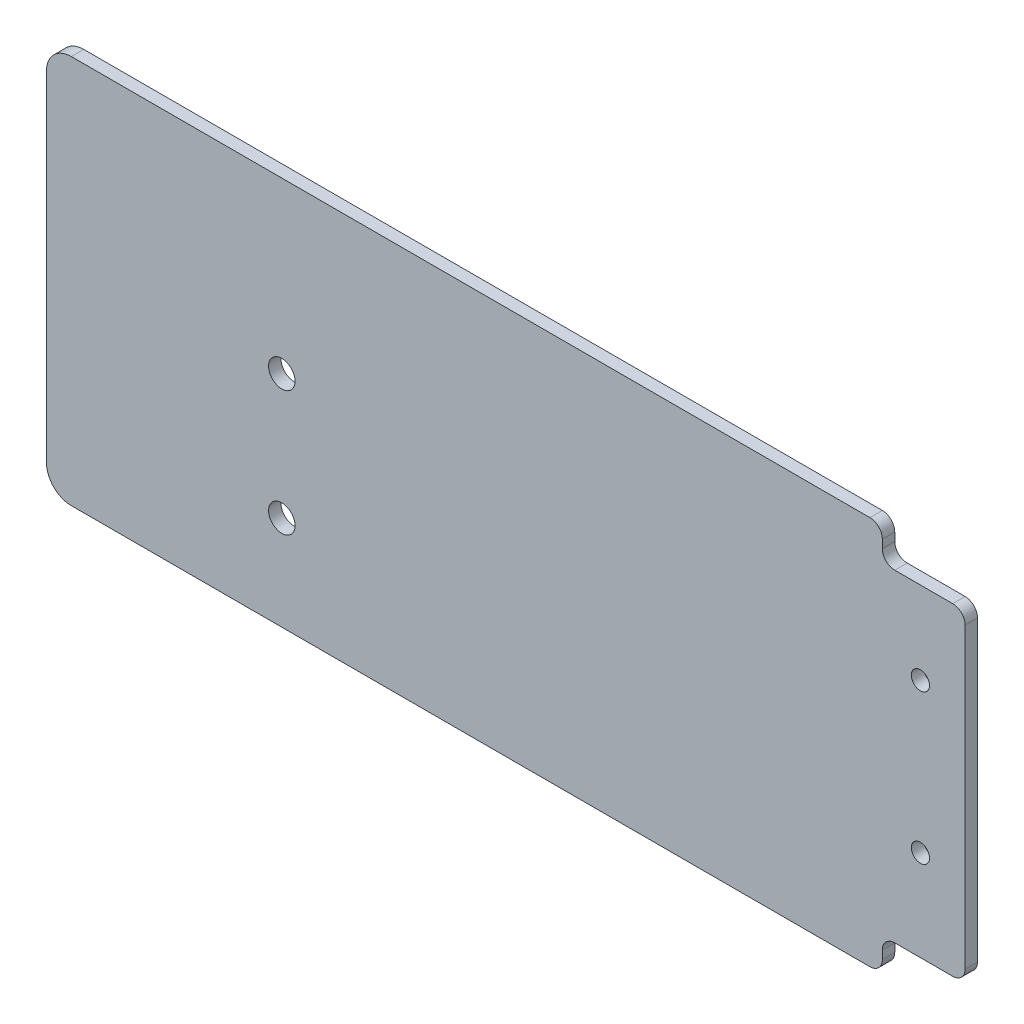
ISO-10303-21;
HEADER;
FILE_DESCRIPTION(('STEP AP214'),'2;1');
FILE_NAME('part.step','',(''),(''),'','','');
FILE_SCHEMA(('AUTOMOTIVE_DESIGN { 1 0 10303 214 1 1 1 1 }'));
ENDSEC;
DATA;
#1=APPLICATION_CONTEXT('core data for automotive mechanical design processes');
#2=APPLICATION_PROTOCOL_DEFINITION('international standard','automotive_design',2000,#1);
#3=PRODUCT_CONTEXT('',#1,'mechanical');
#4=PRODUCT('Part','Part','',(#3));
#5=PRODUCT_RELATED_PRODUCT_CATEGORY('part','',(#4));
#6=PRODUCT_DEFINITION_FORMATION('','',#4);
#7=PRODUCT_DEFINITION_CONTEXT('part definition',#1,'design');
#8=PRODUCT_DEFINITION('design','',#6,#7);
#9=PRODUCT_DEFINITION_SHAPE('','',#8);
#10=(LENGTH_UNIT() NAMED_UNIT(*) SI_UNIT(.MILLI.,.METRE.));
#11=(NAMED_UNIT(*) PLANE_ANGLE_UNIT() SI_UNIT($,.RADIAN.));
#12=(NAMED_UNIT(*) SI_UNIT($,.STERADIAN.) SOLID_ANGLE_UNIT());
#13=UNCERTAINTY_MEASURE_WITH_UNIT(LENGTH_MEASURE(1.E-05),#10,'distance_accuracy_value','');
#14=(GEOMETRIC_REPRESENTATION_CONTEXT(3) GLOBAL_UNCERTAINTY_ASSIGNED_CONTEXT((#13)) GLOBAL_UNIT_ASSIGNED_CONTEXT((#10,
#11,#12)) REPRESENTATION_CONTEXT('',''));
#15=CARTESIAN_POINT('',(0.,0.,0.));
#16=DIRECTION('',(0.,0.,1.));
#17=DIRECTION('',(1.,0.,0.));
#18=AXIS2_PLACEMENT_3D('',#15,#16,#17);
#19=CARTESIAN_POINT('',(3.,-20.5,1.5));
#20=DIRECTION('',(0.,0.,-1.));
#21=DIRECTION('',(-1.,0.,0.));
#22=AXIS2_PLACEMENT_3D('',#19,#20,#21);
#23=PLANE('',#22);
#24=CARTESIAN_POINT('',(105.6,-8.52499999999999,1.5));
#25=DIRECTION('',(0.,0.,1.));
#26=DIRECTION('',(1.,0.,0.));
#27=AXIS2_PLACEMENT_3D('',#24,#25,#26);
#28=CIRCLE('',#27,1.09999999999999);
#29=CARTESIAN_POINT('',(106.7,-8.52499999999999,1.5));
#30=VERTEX_POINT('',#29);
#31=EDGE_CURVE('E402',#30,#30,#28,.T.);
#32=ORIENTED_EDGE('',*,*,#31,.F.);
#33=EDGE_LOOP('',(#32));
#34=FACE_BOUND('',#33,.T.);
#35=DIRECTION('',(1.,0.,0.));
#36=VECTOR('',#35,1.);
#37=CARTESIAN_POINT('',(3.,-23.5,1.5));
#38=LINE('',#37,#36);
#39=CARTESIAN_POINT('',(3.,-23.5,1.5));
#40=VERTEX_POINT('',#39);
#41=CARTESIAN_POINT('',(99.5,-23.5,1.5));
#42=VERTEX_POINT('',#41);
#43=EDGE_CURVE('E182',#40,#42,#38,.T.);
#44=ORIENTED_EDGE('',*,*,#43,.T.);
#45=CARTESIAN_POINT('',(99.5,-22.,1.5));
#46=DIRECTION('',(0.,0.,-1.));
#47=DIRECTION('',(-1.,0.,0.));
#48=AXIS2_PLACEMENT_3D('',#45,#46,#47);
#49=CIRCLE('',#48,1.5);
#50=CARTESIAN_POINT('',(101.,-22.,1.5));
#51=VERTEX_POINT('',#50);
#52=EDGE_CURVE('E247',#42,#51,#49,.F.);
#53=ORIENTED_EDGE('',*,*,#52,.T.);
#54=DIRECTION('',(0.,1.,0.));
#55=VECTOR('',#54,1.);
#56=CARTESIAN_POINT('',(101.,0.,1.5));
#57=LINE('',#56,#55);
#58=CARTESIAN_POINT('',(101.,-21.,1.5));
#59=VERTEX_POINT('',#58);
#60=EDGE_CURVE('E364',#51,#59,#57,.T.);
#61=ORIENTED_EDGE('',*,*,#60,.T.);
#62=CARTESIAN_POINT('',(102.5,-21.,1.5));
#63=DIRECTION('',(0.,0.,-1.));
#64=DIRECTION('',(-1.,0.,0.));
#65=AXIS2_PLACEMENT_3D('',#62,#63,#64);
#66=CIRCLE('',#65,1.5);
#67=CARTESIAN_POINT('',(102.5,-19.5,1.5));
#68=VERTEX_POINT('',#67);
#69=EDGE_CURVE('E285',#59,#68,#66,.T.);
#70=ORIENTED_EDGE('',*,*,#69,.T.);
#71=DIRECTION('',(1.,0.,0.));
#72=VECTOR('',#71,1.);
#73=CARTESIAN_POINT('',(0.,-19.5,1.5));
#74=LINE('',#73,#72);
#75=CARTESIAN_POINT('',(109.5,-19.5,1.5));
#76=VERTEX_POINT('',#75);
#77=EDGE_CURVE('E306',#68,#76,#74,.T.);
#78=ORIENTED_EDGE('',*,*,#77,.T.);
#79=CARTESIAN_POINT('',(109.5,-18.,1.5));
#80=DIRECTION('',(0.,0.,-1.));
#81=DIRECTION('',(-1.,0.,0.));
#82=AXIS2_PLACEMENT_3D('',#79,#80,#81);
#83=CIRCLE('',#82,1.5);
#84=CARTESIAN_POINT('',(111.,-18.,1.5));
#85=VERTEX_POINT('',#84);
#86=EDGE_CURVE('E244',#76,#85,#83,.F.);
#87=ORIENTED_EDGE('',*,*,#86,.T.);
#88=DIRECTION('',(0.,1.,0.));
#89=VECTOR('',#88,1.);
#90=CARTESIAN_POINT('',(111.,-21.5,1.5));
#91=LINE('',#90,#89);
#92=CARTESIAN_POINT('',(111.,18.,1.5));
#93=VERTEX_POINT('',#92);
#94=EDGE_CURVE('E193',#85,#93,#91,.T.);
#95=ORIENTED_EDGE('',*,*,#94,.T.);
#96=CARTESIAN_POINT('',(109.5,18.,1.5));
#97=DIRECTION('',(0.,0.,-1.));
#98=DIRECTION('',(-1.,0.,0.));
#99=AXIS2_PLACEMENT_3D('',#96,#97,#98);
#100=CIRCLE('',#99,1.5);
#101=CARTESIAN_POINT('',(109.5,19.5,1.5));
#102=VERTEX_POINT('',#101);
#103=EDGE_CURVE('E241',#93,#102,#100,.F.);
#104=ORIENTED_EDGE('',*,*,#103,.T.);
#105=DIRECTION('',(1.,0.,0.));
#106=VECTOR('',#105,1.);
#107=CARTESIAN_POINT('',(0.,19.5,1.5));
#108=LINE('',#107,#106);
#109=CARTESIAN_POINT('',(102.5,19.5,1.5));
#110=VERTEX_POINT('',#109);
#111=EDGE_CURVE('E314',#110,#102,#108,.T.);
#112=ORIENTED_EDGE('',*,*,#111,.F.);
#113=CARTESIAN_POINT('',(102.5,21.,1.5));
#114=DIRECTION('',(0.,0.,-1.));
#115=DIRECTION('',(-1.,0.,0.));
#116=AXIS2_PLACEMENT_3D('',#113,#114,#115);
#117=CIRCLE('',#116,1.5);
#118=CARTESIAN_POINT('',(101.,21.,1.5));
#119=VERTEX_POINT('',#118);
#120=EDGE_CURVE('E11',#110,#119,#117,.T.);
#121=ORIENTED_EDGE('',*,*,#120,.T.);
#122=DIRECTION('',(0.,-1.,0.));
#123=VECTOR('',#122,1.);
#124=CARTESIAN_POINT('',(101.,0.,1.5));
#125=LINE('',#124,#123);
#126=CARTESIAN_POINT('',(101.,22.,1.5));
#127=VERTEX_POINT('',#126);
#128=EDGE_CURVE('E312',#127,#119,#125,.T.);
#129=ORIENTED_EDGE('',*,*,#128,.F.);
#130=CARTESIAN_POINT('',(99.5,22.,1.5));
#131=DIRECTION('',(0.,0.,-1.));
#132=DIRECTION('',(-1.,0.,0.));
#133=AXIS2_PLACEMENT_3D('',#130,#131,#132);
#134=CIRCLE('',#133,1.5);
#135=CARTESIAN_POINT('',(99.5,23.5,1.5));
#136=VERTEX_POINT('',#135);
#137=EDGE_CURVE('E59',#127,#136,#134,.F.);
#138=ORIENTED_EDGE('',*,*,#137,.T.);
#139=DIRECTION('',(-1.,0.,0.));
#140=VECTOR('',#139,1.);
#141=CARTESIAN_POINT('',(2.99999999999999,23.5,1.5));
#142=LINE('',#141,#140);
#143=CARTESIAN_POINT('',(2.99999999999999,23.5,1.5));
#144=VERTEX_POINT('',#143);
#145=EDGE_CURVE('E328',#136,#144,#142,.T.);
#146=ORIENTED_EDGE('',*,*,#145,.T.);
#147=CARTESIAN_POINT('',(2.99999999999999,20.5,1.5));
#148=DIRECTION('',(0.,0.,1.));
#149=DIRECTION('',(-1.,0.,0.));
#150=AXIS2_PLACEMENT_3D('',#147,#148,#149);
#151=CIRCLE('',#150,3.);
#152=CARTESIAN_POINT('',(0.,20.5,1.5));
#153=VERTEX_POINT('',#152);
#154=EDGE_CURVE('E331',#144,#153,#151,.T.);
#155=ORIENTED_EDGE('',*,*,#154,.T.);
#156=DIRECTION('',(0.,-1.,0.));
#157=VECTOR('',#156,1.);
#158=CARTESIAN_POINT('',(0.,-20.5,1.5));
#159=LINE('',#158,#157);
#160=CARTESIAN_POINT('',(0.,-20.5,1.5));
#161=VERTEX_POINT('',#160);
#162=EDGE_CURVE('E199',#153,#161,#159,.T.);
#163=ORIENTED_EDGE('',*,*,#162,.T.);
#164=CARTESIAN_POINT('',(3.,-20.5,1.5));
#165=DIRECTION('',(0.,0.,1.));
#166=DIRECTION('',(-1.,0.,0.));
#167=AXIS2_PLACEMENT_3D('',#164,#165,#166);
#168=CIRCLE('',#167,3.);
#169=EDGE_CURVE('E194',#161,#40,#168,.T.);
#170=ORIENTED_EDGE('',*,*,#169,.T.);
#171=EDGE_LOOP('',(#44,#53,#61,#70,#78,#87,#95,#104,#112,#121,#129,#138,#146,#155,#163,#170));
#172=FACE_BOUND('',#171,.T.);
#173=CARTESIAN_POINT('',(28.437,-12.0821,1.5));
#174=DIRECTION('',(0.,0.,1.));
#175=DIRECTION('',(1.,0.,0.));
#176=AXIS2_PLACEMENT_3D('',#173,#174,#175);
#177=CIRCLE('',#176,1.6);
#178=CARTESIAN_POINT('',(30.037,-12.0821,1.5));
#179=VERTEX_POINT('',#178);
#180=EDGE_CURVE('E386',#179,#179,#177,.T.);
#181=ORIENTED_EDGE('',*,*,#180,.F.);
#182=EDGE_LOOP('',(#181));
#183=FACE_BOUND('',#182,.T.);
#184=CARTESIAN_POINT('',(28.437,3.03090000000001,1.5));
#185=DIRECTION('',(0.,0.,1.));
#186=DIRECTION('',(1.,0.,0.));
#187=AXIS2_PLACEMENT_3D('',#184,#185,#186);
#188=CIRCLE('',#187,1.6);
#189=CARTESIAN_POINT('',(30.037,3.03090000000001,1.5));
#190=VERTEX_POINT('',#189);
#191=EDGE_CURVE('E394',#190,#190,#188,.T.);
#192=ORIENTED_EDGE('',*,*,#191,.F.);
#193=EDGE_LOOP('',(#192));
#194=FACE_BOUND('',#193,.T.);
#195=CARTESIAN_POINT('',(105.6,9.52500000000002,1.5));
#196=DIRECTION('',(0.,0.,1.));
#197=DIRECTION('',(1.,0.,0.));
#198=AXIS2_PLACEMENT_3D('',#195,#196,#197);
#199=CIRCLE('',#198,1.09999999999999);
#200=CARTESIAN_POINT('',(106.7,9.52500000000002,1.5));
#201=VERTEX_POINT('',#200);
#202=EDGE_CURVE('E409',#201,#201,#199,.T.);
#203=ORIENTED_EDGE('',*,*,#202,.F.);
#204=EDGE_LOOP('',(#203));
#205=FACE_BOUND('',#204,.T.);
#206=ADVANCED_FACE('F41',(#34,#172,#183,#194,#205),#23,.F.);
#207=CARTESIAN_POINT('',(111.,-21.5,1.5));
#208=DIRECTION('',(-1.,0.,0.));
#209=DIRECTION('',(0.,-1.,0.));
#210=AXIS2_PLACEMENT_3D('',#207,#208,#209);
#211=PLANE('',#210);
#212=ORIENTED_EDGE('',*,*,#94,.F.);
#213=DIRECTION('',(0.,0.,-1.));
#214=VECTOR('',#213,1.);
#215=CARTESIAN_POINT('',(111.,-18.,1.5));
#216=LINE('',#215,#214);
#217=CARTESIAN_POINT('',(111.,-18.,0.));
#218=VERTEX_POINT('',#217);
#219=EDGE_CURVE('E260',#85,#218,#216,.T.);
#220=ORIENTED_EDGE('',*,*,#219,.T.);
#221=DIRECTION('',(0.,1.,0.));
#222=VECTOR('',#221,1.);
#223=CARTESIAN_POINT('',(111.,-21.5,0.));
#224=LINE('',#223,#222);
#225=CARTESIAN_POINT('',(111.,18.,0.));
#226=VERTEX_POINT('',#225);
#227=EDGE_CURVE('E338',#218,#226,#224,.T.);
#228=ORIENTED_EDGE('',*,*,#227,.T.);
#229=DIRECTION('',(0.,0.,-1.));
#230=VECTOR('',#229,1.);
#231=CARTESIAN_POINT('',(111.,18.,1.5));
#232=LINE('',#231,#230);
#233=EDGE_CURVE('E257',#226,#93,#232,.F.);
#234=ORIENTED_EDGE('',*,*,#233,.T.);
#235=EDGE_LOOP('',(#212,#220,#228,#234));
#236=FACE_BOUND('',#235,.T.);
#237=ADVANCED_FACE('F417',(#236),#211,.F.);
#238=CARTESIAN_POINT('',(2.99999999999999,23.5,1.5));
#239=DIRECTION('',(0.,-1.,0.));
#240=DIRECTION('',(1.,0.,0.));
#241=AXIS2_PLACEMENT_3D('',#238,#239,#240);
#242=PLANE('',#241);
#243=ORIENTED_EDGE('',*,*,#145,.F.);
#244=DIRECTION('',(0.,0.,-1.));
#245=VECTOR('',#244,1.);
#246=CARTESIAN_POINT('',(99.5,23.5,0.));
#247=LINE('',#246,#245);
#248=CARTESIAN_POINT('',(99.5,23.5,0.));
#249=VERTEX_POINT('',#248);
#250=EDGE_CURVE('E278',#136,#249,#247,.T.);
#251=ORIENTED_EDGE('',*,*,#250,.T.);
#252=DIRECTION('',(-1.,0.,0.));
#253=VECTOR('',#252,1.);
#254=CARTESIAN_POINT('',(2.99999999999999,23.5,0.));
#255=LINE('',#254,#253);
#256=CARTESIAN_POINT('',(2.99999999999999,23.5,0.));
#257=VERTEX_POINT('',#256);
#258=EDGE_CURVE('E342',#249,#257,#255,.T.);
#259=ORIENTED_EDGE('',*,*,#258,.T.);
#260=DIRECTION('',(0.,0.,-1.));
#261=VECTOR('',#260,1.);
#262=CARTESIAN_POINT('',(2.99999999999999,23.5,1.5));
#263=LINE('',#262,#261);
#264=EDGE_CURVE('E211',#144,#257,#263,.T.);
#265=ORIENTED_EDGE('',*,*,#264,.F.);
#266=EDGE_LOOP('',(#243,#251,#259,#265));
#267=FACE_BOUND('',#266,.T.);
#268=ADVANCED_FACE('F423',(#267),#242,.F.);
#269=CARTESIAN_POINT('',(3.,-20.5,0.));
#270=DIRECTION('',(0.,0.,-1.));
#271=DIRECTION('',(-1.,0.,0.));
#272=AXIS2_PLACEMENT_3D('',#269,#270,#271);
#273=PLANE('',#272);
#274=CARTESIAN_POINT('',(105.6,9.52500000000002,0.));
#275=DIRECTION('',(0.,0.,-1.));
#276=DIRECTION('',(-1.,0.,0.));
#277=AXIS2_PLACEMENT_3D('',#274,#275,#276);
#278=CIRCLE('',#277,1.1);
#279=CARTESIAN_POINT('',(104.5,9.52500000000002,0.));
#280=VERTEX_POINT('',#279);
#281=EDGE_CURVE('E405',#280,#280,#278,.T.);
#282=ORIENTED_EDGE('',*,*,#281,.F.);
#283=EDGE_LOOP('',(#282));
#284=FACE_BOUND('',#283,.T.);
#285=CARTESIAN_POINT('',(105.6,-8.52499999999999,0.));
#286=DIRECTION('',(0.,0.,-1.));
#287=DIRECTION('',(-1.,0.,0.));
#288=AXIS2_PLACEMENT_3D('',#285,#286,#287);
#289=CIRCLE('',#288,1.1);
#290=CARTESIAN_POINT('',(104.5,-8.52499999999999,0.));
#291=VERTEX_POINT('',#290);
#292=EDGE_CURVE('E399',#291,#291,#289,.T.);
#293=ORIENTED_EDGE('',*,*,#292,.F.);
#294=EDGE_LOOP('',(#293));
#295=FACE_BOUND('',#294,.T.);
#296=CARTESIAN_POINT('',(28.437,3.03090000000001,0.));
#297=DIRECTION('',(0.,0.,1.));
#298=DIRECTION('',(1.,0.,0.));
#299=AXIS2_PLACEMENT_3D('',#296,#297,#298);
#300=CIRCLE('',#299,1.6);
#301=CARTESIAN_POINT('',(30.037,3.03090000000001,0.));
#302=VERTEX_POINT('',#301);
#303=EDGE_CURVE('E390',#302,#302,#300,.T.);
#304=ORIENTED_EDGE('',*,*,#303,.T.);
#305=EDGE_LOOP('',(#304));
#306=FACE_BOUND('',#305,.T.);
#307=CARTESIAN_POINT('',(28.437,-12.0821,0.));
#308=DIRECTION('',(0.,0.,1.));
#309=DIRECTION('',(1.,0.,0.));
#310=AXIS2_PLACEMENT_3D('',#307,#308,#309);
#311=CIRCLE('',#310,1.6);
#312=CARTESIAN_POINT('',(30.037,-12.0821,0.));
#313=VERTEX_POINT('',#312);
#314=EDGE_CURVE('E380',#313,#313,#311,.T.);
#315=ORIENTED_EDGE('',*,*,#314,.T.);
#316=EDGE_LOOP('',(#315));
#317=FACE_BOUND('',#316,.T.);
#318=DIRECTION('',(0.,1.,0.));
#319=VECTOR('',#318,1.);
#320=CARTESIAN_POINT('',(101.,0.,0.));
#321=LINE('',#320,#319);
#322=CARTESIAN_POINT('',(101.,-22.,0.));
#323=VERTEX_POINT('',#322);
#324=CARTESIAN_POINT('',(101.,-21.,0.));
#325=VERTEX_POINT('',#324);
#326=EDGE_CURVE('E378',#323,#325,#321,.T.);
#327=ORIENTED_EDGE('',*,*,#326,.F.);
#328=CARTESIAN_POINT('',(99.5,-22.,0.));
#329=DIRECTION('',(0.,0.,-1.));
#330=DIRECTION('',(-1.,0.,0.));
#331=AXIS2_PLACEMENT_3D('',#328,#329,#330);
#332=CIRCLE('',#331,1.5);
#333=CARTESIAN_POINT('',(99.5,-23.5,0.));
#334=VERTEX_POINT('',#333);
#335=EDGE_CURVE('E234',#323,#334,#332,.T.);
#336=ORIENTED_EDGE('',*,*,#335,.T.);
#337=DIRECTION('',(1.,0.,0.));
#338=VECTOR('',#337,1.);
#339=CARTESIAN_POINT('',(3.,-23.5,0.));
#340=LINE('',#339,#338);
#341=CARTESIAN_POINT('',(3.,-23.5,0.));
#342=VERTEX_POINT('',#341);
#343=EDGE_CURVE('E317',#342,#334,#340,.T.);
#344=ORIENTED_EDGE('',*,*,#343,.F.);
#345=CARTESIAN_POINT('',(3.,-20.5,0.));
#346=DIRECTION('',(0.,0.,1.));
#347=DIRECTION('',(-1.,0.,0.));
#348=AXIS2_PLACEMENT_3D('',#345,#346,#347);
#349=CIRCLE('',#348,3.);
#350=CARTESIAN_POINT('',(0.,-20.5,0.));
#351=VERTEX_POINT('',#350);
#352=EDGE_CURVE('E208',#351,#342,#349,.T.);
#353=ORIENTED_EDGE('',*,*,#352,.F.);
#354=DIRECTION('',(0.,-1.,0.));
#355=VECTOR('',#354,1.);
#356=CARTESIAN_POINT('',(0.,-20.5,0.));
#357=LINE('',#356,#355);
#358=CARTESIAN_POINT('',(0.,20.5,0.));
#359=VERTEX_POINT('',#358);
#360=EDGE_CURVE('E204',#359,#351,#357,.T.);
#361=ORIENTED_EDGE('',*,*,#360,.F.);
#362=CARTESIAN_POINT('',(2.99999999999999,20.5,0.));
#363=DIRECTION('',(0.,0.,1.));
#364=DIRECTION('',(-1.,0.,0.));
#365=AXIS2_PLACEMENT_3D('',#362,#363,#364);
#366=CIRCLE('',#365,3.);
#367=EDGE_CURVE('E345',#257,#359,#366,.T.);
#368=ORIENTED_EDGE('',*,*,#367,.F.);
#369=ORIENTED_EDGE('',*,*,#258,.F.);
#370=CARTESIAN_POINT('',(99.5,22.,0.));
#371=DIRECTION('',(0.,0.,-1.));
#372=DIRECTION('',(-1.,0.,0.));
#373=AXIS2_PLACEMENT_3D('',#370,#371,#372);
#374=CIRCLE('',#373,1.5);
#375=CARTESIAN_POINT('',(101.,22.,0.));
#376=VERTEX_POINT('',#375);
#377=EDGE_CURVE('E225',#249,#376,#374,.T.);
#378=ORIENTED_EDGE('',*,*,#377,.T.);
#379=DIRECTION('',(0.,-1.,0.));
#380=VECTOR('',#379,1.);
#381=CARTESIAN_POINT('',(101.,0.,0.));
#382=LINE('',#381,#380);
#383=CARTESIAN_POINT('',(101.,21.,0.));
#384=VERTEX_POINT('',#383);
#385=EDGE_CURVE('E297',#376,#384,#382,.T.);
#386=ORIENTED_EDGE('',*,*,#385,.T.);
#387=CARTESIAN_POINT('',(102.5,21.,0.));
#388=DIRECTION('',(0.,0.,-1.));
#389=DIRECTION('',(-1.,0.,0.));
#390=AXIS2_PLACEMENT_3D('',#387,#388,#389);
#391=CIRCLE('',#390,1.5);
#392=CARTESIAN_POINT('',(102.5,19.5,0.));
#393=VERTEX_POINT('',#392);
#394=EDGE_CURVE('E50',#384,#393,#391,.F.);
#395=ORIENTED_EDGE('',*,*,#394,.T.);
#396=DIRECTION('',(1.,0.,0.));
#397=VECTOR('',#396,1.);
#398=CARTESIAN_POINT('',(0.,19.5,0.));
#399=LINE('',#398,#397);
#400=CARTESIAN_POINT('',(109.5,19.5,0.));
#401=VERTEX_POINT('',#400);
#402=EDGE_CURVE('E295',#393,#401,#399,.T.);
#403=ORIENTED_EDGE('',*,*,#402,.T.);
#404=CARTESIAN_POINT('',(109.5,18.,0.));
#405=DIRECTION('',(0.,0.,-1.));
#406=DIRECTION('',(-1.,0.,0.));
#407=AXIS2_PLACEMENT_3D('',#404,#405,#406);
#408=CIRCLE('',#407,1.5);
#409=EDGE_CURVE('E228',#401,#226,#408,.T.);
#410=ORIENTED_EDGE('',*,*,#409,.T.);
#411=ORIENTED_EDGE('',*,*,#227,.F.);
#412=CARTESIAN_POINT('',(109.5,-18.,0.));
#413=DIRECTION('',(0.,0.,-1.));
#414=DIRECTION('',(-1.,0.,0.));
#415=AXIS2_PLACEMENT_3D('',#412,#413,#414);
#416=CIRCLE('',#415,1.5);
#417=CARTESIAN_POINT('',(109.5,-19.5,0.));
#418=VERTEX_POINT('',#417);
#419=EDGE_CURVE('E231',#218,#418,#416,.T.);
#420=ORIENTED_EDGE('',*,*,#419,.T.);
#421=DIRECTION('',(1.,0.,0.));
#422=VECTOR('',#421,1.);
#423=CARTESIAN_POINT('',(0.,-19.5,0.));
#424=LINE('',#423,#422);
#425=CARTESIAN_POINT('',(102.5,-19.5,0.));
#426=VERTEX_POINT('',#425);
#427=EDGE_CURVE('E371',#426,#418,#424,.T.);
#428=ORIENTED_EDGE('',*,*,#427,.F.);
#429=CARTESIAN_POINT('',(102.5,-21.,0.));
#430=DIRECTION('',(0.,0.,-1.));
#431=DIRECTION('',(-1.,0.,0.));
#432=AXIS2_PLACEMENT_3D('',#429,#430,#431);
#433=CIRCLE('',#432,1.5);
#434=EDGE_CURVE('E282',#426,#325,#433,.F.);
#435=ORIENTED_EDGE('',*,*,#434,.T.);
#436=EDGE_LOOP('',(#327,#336,#344,#353,#361,#368,#369,#378,#386,#395,#403,#410,#411,#420,#428,#435));
#437=FACE_BOUND('',#436,.T.);
#438=ADVANCED_FACE('F294',(#284,#295,#306,#317,#437),#273,.T.);
#439=CARTESIAN_POINT('',(3.,-20.5,1.5));
#440=DIRECTION('',(0.,0.,-1.));
#441=DIRECTION('',(-1.,0.,0.));
#442=AXIS2_PLACEMENT_3D('',#439,#440,#441);
#443=CYLINDRICAL_SURFACE('',#442,3.);
#444=ORIENTED_EDGE('',*,*,#352,.T.);
#445=DIRECTION('',(0.,0.,-1.));
#446=VECTOR('',#445,1.);
#447=CARTESIAN_POINT('',(3.,-23.5,1.5));
#448=LINE('',#447,#446);
#449=EDGE_CURVE('E187',#40,#342,#448,.T.);
#450=ORIENTED_EDGE('',*,*,#449,.F.);
#451=ORIENTED_EDGE('',*,*,#169,.F.);
#452=DIRECTION('',(0.,0.,-1.));
#453=VECTOR('',#452,1.);
#454=CARTESIAN_POINT('',(0.,-20.5,1.5));
#455=LINE('',#454,#453);
#456=EDGE_CURVE('E334',#161,#351,#455,.T.);
#457=ORIENTED_EDGE('',*,*,#456,.T.);
#458=EDGE_LOOP('',(#444,#450,#451,#457));
#459=FACE_BOUND('',#458,.T.);
#460=ADVANCED_FACE('F206',(#459),#443,.T.);
#461=CARTESIAN_POINT('',(3.,-23.5,1.5));
#462=DIRECTION('',(0.,1.,0.));
#463=DIRECTION('',(0.,0.,1.));
#464=AXIS2_PLACEMENT_3D('',#461,#462,#463);
#465=PLANE('',#464);
#466=ORIENTED_EDGE('',*,*,#343,.T.);
#467=DIRECTION('',(0.,0.,-1.));
#468=VECTOR('',#467,1.);
#469=CARTESIAN_POINT('',(99.5,-23.5,1.5));
#470=LINE('',#469,#468);
#471=EDGE_CURVE('E190',#334,#42,#470,.F.);
#472=ORIENTED_EDGE('',*,*,#471,.T.);
#473=ORIENTED_EDGE('',*,*,#43,.F.);
#474=ORIENTED_EDGE('',*,*,#449,.T.);
#475=EDGE_LOOP('',(#466,#472,#473,#474));
#476=FACE_BOUND('',#475,.T.);
#477=ADVANCED_FACE('F185',(#476),#465,.F.);
#478=CARTESIAN_POINT('',(2.99999999999999,20.5,1.5));
#479=DIRECTION('',(0.,0.,-1.));
#480=DIRECTION('',(-1.,0.,0.));
#481=AXIS2_PLACEMENT_3D('',#478,#479,#480);
#482=CYLINDRICAL_SURFACE('',#481,3.);
#483=ORIENTED_EDGE('',*,*,#367,.T.);
#484=DIRECTION('',(0.,0.,-1.));
#485=VECTOR('',#484,1.);
#486=CARTESIAN_POINT('',(0.,20.5,1.5));
#487=LINE('',#486,#485);
#488=EDGE_CURVE('E218',#153,#359,#487,.T.);
#489=ORIENTED_EDGE('',*,*,#488,.F.);
#490=ORIENTED_EDGE('',*,*,#154,.F.);
#491=ORIENTED_EDGE('',*,*,#264,.T.);
#492=EDGE_LOOP('',(#483,#489,#490,#491));
#493=FACE_BOUND('',#492,.T.);
#494=ADVANCED_FACE('F435',(#493),#482,.T.);
#495=CARTESIAN_POINT('',(0.,-20.5,1.5));
#496=DIRECTION('',(1.,0.,0.));
#497=DIRECTION('',(0.,1.,0.));
#498=AXIS2_PLACEMENT_3D('',#495,#496,#497);
#499=PLANE('',#498);
#500=ORIENTED_EDGE('',*,*,#360,.T.);
#501=ORIENTED_EDGE('',*,*,#456,.F.);
#502=ORIENTED_EDGE('',*,*,#162,.F.);
#503=ORIENTED_EDGE('',*,*,#488,.T.);
#504=EDGE_LOOP('',(#500,#501,#502,#503));
#505=FACE_BOUND('',#504,.T.);
#506=ADVANCED_FACE('F354',(#505),#499,.F.);
#507=CARTESIAN_POINT('',(0.,19.5,1.5));
#508=DIRECTION('',(0.,1.,0.));
#509=DIRECTION('',(0.,0.,1.));
#510=AXIS2_PLACEMENT_3D('',#507,#508,#509);
#511=PLANE('',#510);
#512=ORIENTED_EDGE('',*,*,#111,.T.);
#513=DIRECTION('',(0.,0.,-1.));
#514=VECTOR('',#513,1.);
#515=CARTESIAN_POINT('',(109.5,19.5,0.));
#516=LINE('',#515,#514);
#517=EDGE_CURVE('E267',#102,#401,#516,.T.);
#518=ORIENTED_EDGE('',*,*,#517,.T.);
#519=ORIENTED_EDGE('',*,*,#402,.F.);
#520=DIRECTION('',(0.,0.,-1.));
#521=VECTOR('',#520,1.);
#522=CARTESIAN_POINT('',(102.5,19.5,1.5));
#523=LINE('',#522,#521);
#524=EDGE_CURVE('E264',#393,#110,#523,.F.);
#525=ORIENTED_EDGE('',*,*,#524,.T.);
#526=EDGE_LOOP('',(#512,#518,#519,#525));
#527=FACE_BOUND('',#526,.T.);
#528=ADVANCED_FACE('F303',(#527),#511,.T.);
#529=CARTESIAN_POINT('',(101.,0.,1.5));
#530=DIRECTION('',(1.,0.,0.));
#531=DIRECTION('',(0.,0.,-1.));
#532=AXIS2_PLACEMENT_3D('',#529,#530,#531);
#533=PLANE('',#532);
#534=ORIENTED_EDGE('',*,*,#128,.T.);
#535=DIRECTION('',(0.,0.,-1.));
#536=VECTOR('',#535,1.);
#537=CARTESIAN_POINT('',(101.,21.,0.));
#538=LINE('',#537,#536);
#539=EDGE_CURVE('E274',#119,#384,#538,.T.);
#540=ORIENTED_EDGE('',*,*,#539,.T.);
#541=ORIENTED_EDGE('',*,*,#385,.F.);
#542=DIRECTION('',(0.,0.,-1.));
#543=VECTOR('',#542,1.);
#544=CARTESIAN_POINT('',(101.,22.,1.5));
#545=LINE('',#544,#543);
#546=EDGE_CURVE('E271',#376,#127,#545,.F.);
#547=ORIENTED_EDGE('',*,*,#546,.T.);
#548=EDGE_LOOP('',(#534,#540,#541,#547));
#549=FACE_BOUND('',#548,.T.);
#550=ADVANCED_FACE('F310',(#549),#533,.T.);
#551=CARTESIAN_POINT('',(0.,-19.5,1.5));
#552=DIRECTION('',(0.,1.,0.));
#553=DIRECTION('',(0.,0.,1.));
#554=AXIS2_PLACEMENT_3D('',#551,#552,#553);
#555=PLANE('',#554);
#556=ORIENTED_EDGE('',*,*,#77,.F.);
#557=DIRECTION('',(0.,0.,-1.));
#558=VECTOR('',#557,1.);
#559=CARTESIAN_POINT('',(102.5,-19.5,0.));
#560=LINE('',#559,#558);
#561=EDGE_CURVE('E253',#68,#426,#560,.T.);
#562=ORIENTED_EDGE('',*,*,#561,.T.);
#563=ORIENTED_EDGE('',*,*,#427,.T.);
#564=DIRECTION('',(0.,0.,-1.));
#565=VECTOR('',#564,1.);
#566=CARTESIAN_POINT('',(109.5,-19.5,1.5));
#567=LINE('',#566,#565);
#568=EDGE_CURVE('E250',#418,#76,#567,.F.);
#569=ORIENTED_EDGE('',*,*,#568,.T.);
#570=EDGE_LOOP('',(#556,#562,#563,#569));
#571=FACE_BOUND('',#570,.T.);
#572=ADVANCED_FACE('F480',(#571),#555,.F.);
#573=CARTESIAN_POINT('',(101.,0.,1.5));
#574=DIRECTION('',(-1.,0.,0.));
#575=DIRECTION('',(0.,0.,1.));
#576=AXIS2_PLACEMENT_3D('',#573,#574,#575);
#577=PLANE('',#576);
#578=ORIENTED_EDGE('',*,*,#60,.F.);
#579=DIRECTION('',(0.,0.,-1.));
#580=VECTOR('',#579,1.);
#581=CARTESIAN_POINT('',(101.,-22.,1.5));
#582=LINE('',#581,#580);
#583=EDGE_CURVE('E215',#51,#323,#582,.T.);
#584=ORIENTED_EDGE('',*,*,#583,.T.);
#585=ORIENTED_EDGE('',*,*,#326,.T.);
#586=DIRECTION('',(0.,0.,-1.));
#587=VECTOR('',#586,1.);
#588=CARTESIAN_POINT('',(101.,-21.,1.5));
#589=LINE('',#588,#587);
#590=EDGE_CURVE('E210',#325,#59,#589,.F.);
#591=ORIENTED_EDGE('',*,*,#590,.T.);
#592=EDGE_LOOP('',(#578,#584,#585,#591));
#593=FACE_BOUND('',#592,.T.);
#594=ADVANCED_FACE('F367',(#593),#577,.F.);
#595=CARTESIAN_POINT('',(99.5,-22.,1.5));
#596=DIRECTION('',(0.,0.,-1.));
#597=DIRECTION('',(-1.,0.,0.));
#598=AXIS2_PLACEMENT_3D('',#595,#596,#597);
#599=CYLINDRICAL_SURFACE('',#598,1.5);
#600=ORIENTED_EDGE('',*,*,#52,.F.);
#601=ORIENTED_EDGE('',*,*,#471,.F.);
#602=ORIENTED_EDGE('',*,*,#335,.F.);
#603=ORIENTED_EDGE('',*,*,#583,.F.);
#604=EDGE_LOOP('',(#600,#601,#602,#603));
#605=FACE_BOUND('',#604,.T.);
#606=ADVANCED_FACE('F360',(#605),#599,.T.);
#607=CARTESIAN_POINT('',(102.5,-21.,1.5));
#608=DIRECTION('',(0.,0.,1.));
#609=DIRECTION('',(1.,0.,0.));
#610=AXIS2_PLACEMENT_3D('',#607,#608,#609);
#611=CYLINDRICAL_SURFACE('',#610,1.5);
#612=ORIENTED_EDGE('',*,*,#69,.F.);
#613=ORIENTED_EDGE('',*,*,#590,.F.);
#614=ORIENTED_EDGE('',*,*,#434,.F.);
#615=ORIENTED_EDGE('',*,*,#561,.F.);
#616=EDGE_LOOP('',(#612,#613,#614,#615));
#617=FACE_BOUND('',#616,.T.);
#618=ADVANCED_FACE('F447',(#617),#611,.F.);
#619=CARTESIAN_POINT('',(109.5,-18.,1.5));
#620=DIRECTION('',(0.,0.,-1.));
#621=DIRECTION('',(-1.,0.,0.));
#622=AXIS2_PLACEMENT_3D('',#619,#620,#621);
#623=CYLINDRICAL_SURFACE('',#622,1.5);
#624=ORIENTED_EDGE('',*,*,#86,.F.);
#625=ORIENTED_EDGE('',*,*,#568,.F.);
#626=ORIENTED_EDGE('',*,*,#419,.F.);
#627=ORIENTED_EDGE('',*,*,#219,.F.);
#628=EDGE_LOOP('',(#624,#625,#626,#627));
#629=FACE_BOUND('',#628,.T.);
#630=ADVANCED_FACE('F450',(#629),#623,.T.);
#631=CARTESIAN_POINT('',(109.5,18.,1.5));
#632=DIRECTION('',(0.,0.,1.));
#633=DIRECTION('',(1.,0.,0.));
#634=AXIS2_PLACEMENT_3D('',#631,#632,#633);
#635=CYLINDRICAL_SURFACE('',#634,1.5);
#636=ORIENTED_EDGE('',*,*,#103,.F.);
#637=ORIENTED_EDGE('',*,*,#233,.F.);
#638=ORIENTED_EDGE('',*,*,#409,.F.);
#639=ORIENTED_EDGE('',*,*,#517,.F.);
#640=EDGE_LOOP('',(#636,#637,#638,#639));
#641=FACE_BOUND('',#640,.T.);
#642=ADVANCED_FACE('F454',(#641),#635,.T.);
#643=CARTESIAN_POINT('',(102.5,21.,1.5));
#644=DIRECTION('',(0.,0.,1.));
#645=DIRECTION('',(1.,0.,0.));
#646=AXIS2_PLACEMENT_3D('',#643,#644,#645);
#647=CYLINDRICAL_SURFACE('',#646,1.5);
#648=ORIENTED_EDGE('',*,*,#120,.F.);
#649=ORIENTED_EDGE('',*,*,#524,.F.);
#650=ORIENTED_EDGE('',*,*,#394,.F.);
#651=ORIENTED_EDGE('',*,*,#539,.F.);
#652=EDGE_LOOP('',(#648,#649,#650,#651));
#653=FACE_BOUND('',#652,.T.);
#654=ADVANCED_FACE('F308',(#653),#647,.F.);
#655=CARTESIAN_POINT('',(99.5,22.,1.5));
#656=DIRECTION('',(0.,0.,1.));
#657=DIRECTION('',(1.,0.,0.));
#658=AXIS2_PLACEMENT_3D('',#655,#656,#657);
#659=CYLINDRICAL_SURFACE('',#658,1.5);
#660=ORIENTED_EDGE('',*,*,#137,.F.);
#661=ORIENTED_EDGE('',*,*,#546,.F.);
#662=ORIENTED_EDGE('',*,*,#377,.F.);
#663=ORIENTED_EDGE('',*,*,#250,.F.);
#664=EDGE_LOOP('',(#660,#661,#662,#663));
#665=FACE_BOUND('',#664,.T.);
#666=ADVANCED_FACE('F43',(#665),#659,.T.);
#667=CARTESIAN_POINT('',(28.437,-12.0821,1.5));
#668=DIRECTION('',(0.,0.,1.));
#669=DIRECTION('',(1.,0.,0.));
#670=AXIS2_PLACEMENT_3D('',#667,#668,#669);
#671=CYLINDRICAL_SURFACE('',#670,1.6);
#672=ORIENTED_EDGE('',*,*,#314,.F.);
#673=EDGE_LOOP('',(#672));
#674=FACE_BOUND('',#673,.T.);
#675=ORIENTED_EDGE('',*,*,#180,.T.);
#676=EDGE_LOOP('',(#675));
#677=FACE_BOUND('',#676,.T.);
#678=ADVANCED_FACE('F462',(#674,#677),#671,.F.);
#679=CARTESIAN_POINT('',(28.437,3.03090000000001,1.5));
#680=DIRECTION('',(0.,0.,1.));
#681=DIRECTION('',(1.,0.,0.));
#682=AXIS2_PLACEMENT_3D('',#679,#680,#681);
#683=CYLINDRICAL_SURFACE('',#682,1.6);
#684=ORIENTED_EDGE('',*,*,#303,.F.);
#685=EDGE_LOOP('',(#684));
#686=FACE_BOUND('',#685,.T.);
#687=ORIENTED_EDGE('',*,*,#191,.T.);
#688=EDGE_LOOP('',(#687));
#689=FACE_BOUND('',#688,.T.);
#690=ADVANCED_FACE('F467',(#686,#689),#683,.F.);
#691=CARTESIAN_POINT('',(105.6,-8.52499999999999,1.5));
#692=DIRECTION('',(0.,0.,1.));
#693=DIRECTION('',(1.,0.,0.));
#694=AXIS2_PLACEMENT_3D('',#691,#692,#693);
#695=CYLINDRICAL_SURFACE('',#694,1.1);
#696=ORIENTED_EDGE('',*,*,#31,.T.);
#697=EDGE_LOOP('',(#696));
#698=FACE_BOUND('',#697,.T.);
#699=ORIENTED_EDGE('',*,*,#292,.T.);
#700=EDGE_LOOP('',(#699));
#701=FACE_BOUND('',#700,.T.);
#702=ADVANCED_FACE('F475',(#698,#701),#695,.F.);
#703=CARTESIAN_POINT('',(105.6,9.52500000000002,1.5));
#704=DIRECTION('',(0.,0.,1.));
#705=DIRECTION('',(1.,0.,0.));
#706=AXIS2_PLACEMENT_3D('',#703,#704,#705);
#707=CYLINDRICAL_SURFACE('',#706,1.1);
#708=ORIENTED_EDGE('',*,*,#202,.T.);
#709=EDGE_LOOP('',(#708));
#710=FACE_BOUND('',#709,.T.);
#711=ORIENTED_EDGE('',*,*,#281,.T.);
#712=EDGE_LOOP('',(#711));
#713=FACE_BOUND('',#712,.T.);
#714=ADVANCED_FACE('F413',(#710,#713),#707,.F.);
#715=CLOSED_SHELL('',(#206,#237,#268,#438,#460,#477,#494,#506,#528,#550,#572,#594,#606,#618,
#630,#642,#654,#666,#678,#690,#702,#714));
#716=MANIFOLD_SOLID_BREP('B2',#715);
#717=ADVANCED_BREP_SHAPE_REPRESENTATION('',(#18,#716),#14);
#718=SHAPE_DEFINITION_REPRESENTATION(#9,#717);
ENDSEC;
END-ISO-10303-21;
